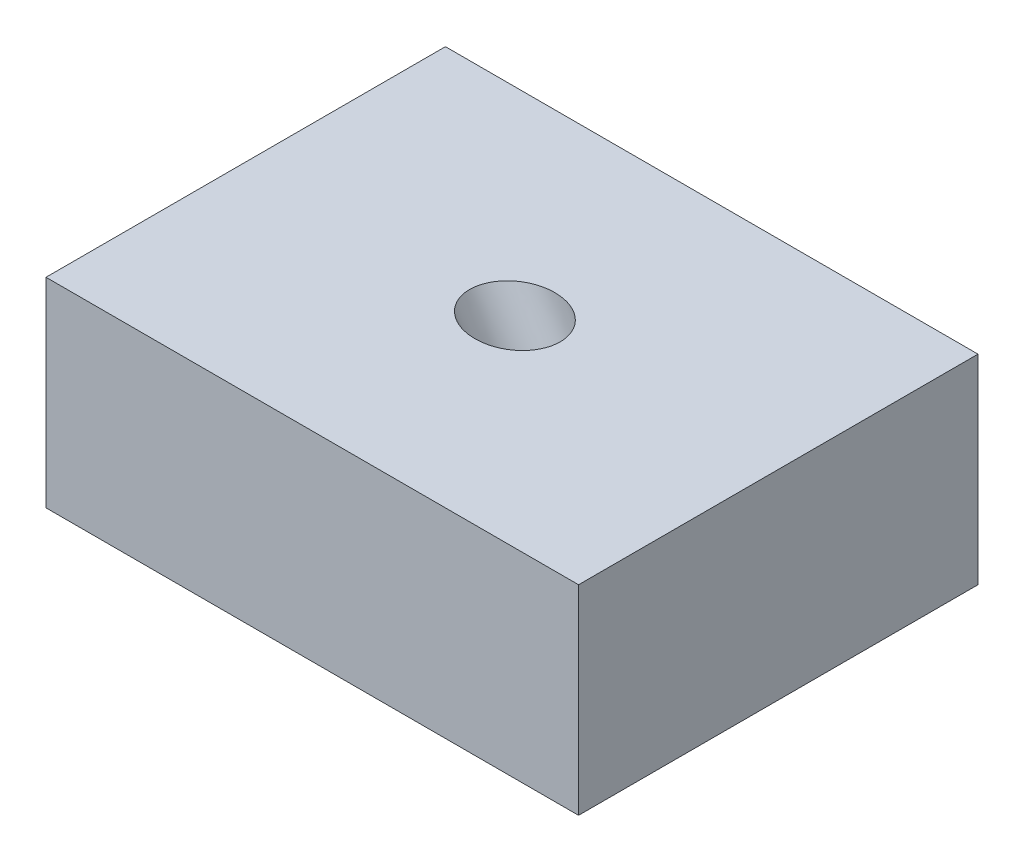
ISO-10303-21;
HEADER;
FILE_DESCRIPTION(('STEP AP214'),'2;1');
FILE_NAME('part.step','',(''),(''),'','','');
FILE_SCHEMA(('AUTOMOTIVE_DESIGN { 1 0 10303 214 1 1 1 1 }'));
ENDSEC;
DATA;
#1=APPLICATION_CONTEXT('core data for automotive mechanical design processes');
#2=APPLICATION_PROTOCOL_DEFINITION('international standard','automotive_design',2000,#1);
#3=PRODUCT_CONTEXT('',#1,'mechanical');
#4=PRODUCT('Part','Part','',(#3));
#5=PRODUCT_RELATED_PRODUCT_CATEGORY('part','',(#4));
#6=PRODUCT_DEFINITION_FORMATION('','',#4);
#7=PRODUCT_DEFINITION_CONTEXT('part definition',#1,'design');
#8=PRODUCT_DEFINITION('design','',#6,#7);
#9=PRODUCT_DEFINITION_SHAPE('','',#8);
#10=(LENGTH_UNIT() NAMED_UNIT(*) SI_UNIT(.MILLI.,.METRE.));
#11=(NAMED_UNIT(*) PLANE_ANGLE_UNIT() SI_UNIT($,.RADIAN.));
#12=(NAMED_UNIT(*) SI_UNIT($,.STERADIAN.) SOLID_ANGLE_UNIT());
#13=UNCERTAINTY_MEASURE_WITH_UNIT(LENGTH_MEASURE(1.E-05),#10,'distance_accuracy_value','');
#14=(GEOMETRIC_REPRESENTATION_CONTEXT(3) GLOBAL_UNCERTAINTY_ASSIGNED_CONTEXT((#13)) GLOBAL_UNIT_ASSIGNED_CONTEXT((#10,
#11,#12)) REPRESENTATION_CONTEXT('',''));
#15=CARTESIAN_POINT('',(0.,0.,0.));
#16=DIRECTION('',(0.,0.,1.));
#17=DIRECTION('',(1.,0.,0.));
#18=AXIS2_PLACEMENT_3D('',#15,#16,#17);
#19=CARTESIAN_POINT('',(0.,30.,0.));
#20=DIRECTION('',(0.,1.,0.));
#21=DIRECTION('',(0.,0.,1.));
#22=AXIS2_PLACEMENT_3D('',#19,#20,#21);
#23=PLANE('',#22);
#24=DIRECTION('',(0.,0.,-1.));
#25=VECTOR('',#24,1.);
#26=CARTESIAN_POINT('',(40.,30.,-30.));
#27=LINE('',#26,#25);
#28=CARTESIAN_POINT('',(40.,30.,30.));
#29=VERTEX_POINT('',#28);
#30=CARTESIAN_POINT('',(40.,30.,-30.));
#31=VERTEX_POINT('',#30);
#32=EDGE_CURVE('E240',#29,#31,#27,.T.);
#33=ORIENTED_EDGE('',*,*,#32,.T.);
#34=DIRECTION('',(-1.,0.,0.));
#35=VECTOR('',#34,1.);
#36=CARTESIAN_POINT('',(-40.,30.,-30.));
#37=LINE('',#36,#35);
#38=CARTESIAN_POINT('',(-40.,30.,-30.));
#39=VERTEX_POINT('',#38);
#40=EDGE_CURVE('E235',#31,#39,#37,.T.);
#41=ORIENTED_EDGE('',*,*,#40,.T.);
#42=DIRECTION('',(0.,0.,1.));
#43=VECTOR('',#42,1.);
#44=CARTESIAN_POINT('',(-40.,30.,-30.));
#45=LINE('',#44,#43);
#46=CARTESIAN_POINT('',(-40.,30.,30.));
#47=VERTEX_POINT('',#46);
#48=EDGE_CURVE('E238',#39,#47,#45,.T.);
#49=ORIENTED_EDGE('',*,*,#48,.T.);
#50=DIRECTION('',(1.,0.,0.));
#51=VECTOR('',#50,1.);
#52=CARTESIAN_POINT('',(-40.,30.,30.));
#53=LINE('',#52,#51);
#54=EDGE_CURVE('E205',#47,#29,#53,.T.);
#55=ORIENTED_EDGE('',*,*,#54,.T.);
#56=EDGE_LOOP('',(#33,#41,#49,#55));
#57=FACE_BOUND('',#56,.T.);
#58=CARTESIAN_POINT('',(7.02625452931541,30.,-0.221368563252611));
#59=CARTESIAN_POINT('',(7.02625536412438,30.,-0.0680039688627962));
#60=CARTESIAN_POINT('',(7.01957304740906,30.,0.0853508334510149));
#61=CARTESIAN_POINT('',(6.99292476476251,30.,0.390970297736343));
#62=CARTESIAN_POINT('',(6.97295320971541,30.,0.543234473772325));
#63=CARTESIAN_POINT('',(6.91996927202058,30.,0.845472321438903));
#64=CARTESIAN_POINT('',(6.88695680456354,30.,0.995445978166916));
#65=CARTESIAN_POINT('',(6.80830807049809,30.,1.29197342505064));
#66=CARTESIAN_POINT('',(6.76267713445538,30.,1.43852863101665));
#67=CARTESIAN_POINT('',(6.66007752915421,30.,1.72517312428354));
#68=CARTESIAN_POINT('',(6.60328569663295,30.,1.86532584440722));
#69=CARTESIAN_POINT('',(6.47862417067005,30.,2.14044098757453));
#70=CARTESIAN_POINT('',(6.41076544593485,30.,2.27540838792105));
#71=CARTESIAN_POINT('',(6.26460700739432,30.,2.53956105947798));
#72=CARTESIAN_POINT('',(6.18630707747373,30.,2.66874621093169));
#73=CARTESIAN_POINT('',(6.01997721267765,30.,2.92072266085493));
#74=CARTESIAN_POINT('',(5.93194520643918,30.,3.04351258996043));
#75=CARTESIAN_POINT('',(5.74696962591476,30.,3.2820692952767));
#76=CARTESIAN_POINT('',(5.65003100306413,30.,3.39783991500167));
#77=CARTESIAN_POINT('',(5.44795718297497,30.,3.62200125239204));
#78=CARTESIAN_POINT('',(5.34282088128674,30.,3.73039097195205));
#79=CARTESIAN_POINT('',(5.09999644616418,30.,3.96353656126034));
#80=CARTESIAN_POINT('',(4.96039235051476,30.,4.0863032760649));
#81=CARTESIAN_POINT('',(4.67129510503231,30.,4.3195921775653));
#82=CARTESIAN_POINT('',(4.52180013595067,30.,4.43011210162849));
#83=CARTESIAN_POINT('',(4.2143755116574,30.,4.63843471724071));
#84=CARTESIAN_POINT('',(4.05645284177239,30.,4.73624771691119));
#85=CARTESIAN_POINT('',(3.73330887647831,30.,4.91901237630198));
#86=CARTESIAN_POINT('',(3.56808480441496,30.,5.0039590877674));
#87=CARTESIAN_POINT('',(3.06351798708295,30.,5.2390451621415));
#88=CARTESIAN_POINT('',(2.71487439410136,30.,5.36970272094007));
#89=CARTESIAN_POINT('',(2.00241315912417,30.,5.57781472194463));
#90=CARTESIAN_POINT('',(1.63859868239182,30.,5.65528020385055));
#91=CARTESIAN_POINT('',(0.903637454972762,30.,5.7568782637916));
#92=CARTESIAN_POINT('',(0.532491489045391,30.,5.78101651907241));
#93=CARTESIAN_POINT('',(-0.209428474756599,30.,5.77587510389124));
#94=CARTESIAN_POINT('',(-0.580202476722962,30.,5.74659602763216));
#95=CARTESIAN_POINT('',(-1.31365671932585,30.,5.63473415281999));
#96=CARTESIAN_POINT('',(-1.67633628106624,29.9999999999999,5.55214690046069));
#97=CARTESIAN_POINT('',(-2.38570994387826,30.0000000000001,5.33383968649401));
#98=CARTESIAN_POINT('',(-2.73240110797264,30.0000000000003,5.19811000603965));
#99=CARTESIAN_POINT('',(-3.2333638304265,30.,4.95551463328195));
#100=CARTESIAN_POINT('',(-3.39727191602754,29.9999999999999,4.86808038797026));
#101=CARTESIAN_POINT('',(-3.7175471964158,30.0000000000001,4.68038768803319));
#102=CARTESIAN_POINT('',(-3.87391734108696,30.0000000000005,4.58013430705572));
#103=CARTESIAN_POINT('',(-4.17419451837879,30.0000000000005,4.36965248816043));
#104=CARTESIAN_POINT('',(-4.31831120612786,30.0000000000001,4.25972302469117));
#105=CARTESIAN_POINT('',(-4.59688229151964,29.9999999999999,4.02832918599172));
#106=CARTESIAN_POINT('',(-4.73134106062058,30.,3.90687008794965));
#107=CARTESIAN_POINT('',(-4.98147534936429,30.,3.66065527542485));
#108=CARTESIAN_POINT('',(-5.09779672982406,29.9999999999997,3.53655571087465));
#109=CARTESIAN_POINT('',(-5.31971320506062,30.0000000000003,3.27918880732789));
#110=CARTESIAN_POINT('',(-5.42531325651506,30.0000000000011,3.14592575302729));
#111=CARTESIAN_POINT('',(-5.61930891143354,30.0000000000009,2.87837615428511));
#112=CARTESIAN_POINT('',(-5.7083289317276,30.0000000000001,2.74454239942556));
#113=CARTESIAN_POINT('',(-5.87494133814234,29.9999999999999,2.46998133900652));
#114=CARTESIAN_POINT('',(-5.95253722859244,30.0000000000006,2.32925616510154));
#115=CARTESIAN_POINT('',(-6.09226933230408,30.0000000000006,2.04817586717094));
#116=CARTESIAN_POINT('',(-6.15494350770511,30.0000000000001,1.90808820236414));
#117=CARTESIAN_POINT('',(-6.26850904494479,29.9999999999999,1.62304733400237));
#118=CARTESIAN_POINT('',(-6.31938888973689,30.0000000000002,1.47808953159103));
#119=CARTESIAN_POINT('',(-6.40795451639184,30.0000000000003,1.18685993611834));
#120=CARTESIAN_POINT('',(-6.44584802259523,30.0000000000001,1.04065135977697));
#121=CARTESIAN_POINT('',(-6.50918595397725,29.9999999999999,0.745493054291883));
#122=CARTESIAN_POINT('',(-6.53462517530892,30.,0.596542206254291));
#123=CARTESIAN_POINT('',(-6.57272360974122,30.,0.297034081430359));
#124=CARTESIAN_POINT('',(-6.58538462371768,30.,0.146477034034386));
#125=CARTESIAN_POINT('',(-6.59777547240046,30.,-0.155101389006927));
#126=CARTESIAN_POINT('',(-6.59751118297555,30.,-0.30612252245569));
#127=CARTESIAN_POINT('',(-6.58420650018885,30.,-0.604521523762282));
#128=CARTESIAN_POINT('',(-6.57142587321872,30.,-0.751911056650899));
#129=CARTESIAN_POINT('',(-6.53364173518032,30.,-1.04495227126537));
#130=CARTESIAN_POINT('',(-6.50865136337168,30.,-1.19060564910125));
#131=CARTESIAN_POINT('',(-6.44674224057049,30.,-1.47933644037913));
#132=CARTESIAN_POINT('',(-6.40982461262918,30.,-1.62241409500855));
#133=CARTESIAN_POINT('',(-6.32442963622259,30.,-1.90521349773038));
#134=CARTESIAN_POINT('',(-6.2759418070647,30.,-2.04493207600816));
#135=CARTESIAN_POINT('',(-6.16733073376555,30.,-2.32157550902624));
#136=CARTESIAN_POINT('',(-6.10708317201679,30.,-2.45845150099632));
#137=CARTESIAN_POINT('',(-5.97589769619188,30.,-2.72704304939911));
#138=CARTESIAN_POINT('',(-5.90495534065291,30.,-2.8587564330724));
#139=CARTESIAN_POINT('',(-5.75305976186311,30.,-3.11630857793755));
#140=CARTESIAN_POINT('',(-5.67210440056629,30.,-3.24214607654084));
#141=CARTESIAN_POINT('',(-5.50090787572972,30.,-3.48734128349735));
#142=CARTESIAN_POINT('',(-5.41066593332055,30.,-3.60669844705765));
#143=CARTESIAN_POINT('',(-5.21488741414568,30.,-3.84671048505417));
#144=CARTESIAN_POINT('',(-5.10871892039051,30.,-3.96684999572656));
#145=CARTESIAN_POINT('',(-4.88759483981967,30.,-4.19851713428326));
#146=CARTESIAN_POINT('',(-4.7726475206201,30.,-4.31005267085251));
#147=CARTESIAN_POINT('',(-4.53477440632526,30.,-4.52425074359901));
#148=CARTESIAN_POINT('',(-4.41184893913304,30.,-4.62691364403904));
#149=CARTESIAN_POINT('',(-4.15888945153438,30.,-4.82307708014528));
#150=CARTESIAN_POINT('',(-4.0288539938769,30.,-4.91657575255916));
#151=CARTESIAN_POINT('',(-3.6295182969855,30.,-5.18284152078281));
#152=CARTESIAN_POINT('',(-3.35074102348365,30.,-5.34159935823776));
#153=CARTESIAN_POINT('',(-2.69336371334247,30.,-5.65950717838606));
#154=CARTESIAN_POINT('',(-2.30873961946365,30.,-5.80621043094774));
#155=CARTESIAN_POINT('',(-1.52097875124978,30.,-6.03467937227404));
#156=CARTESIAN_POINT('',(-1.11784722093076,30.,-6.11646333701816));
#157=CARTESIAN_POINT('',(-0.303856676521069,30.,-6.21486589610431));
#158=CARTESIAN_POINT('',(0.107001319444107,30.,-6.23149301661626));
#159=CARTESIAN_POINT('',(0.92639936036795,30.,-6.19947443991615));
#160=CARTESIAN_POINT('',(1.33493937955282,30.,-6.15082801834421));
#161=CARTESIAN_POINT('',(1.93763039659139,30.,-6.02917592595877));
#162=CARTESIAN_POINT('',(2.13695757160396,30.,-5.98046757580777));
#163=CARTESIAN_POINT('',(2.53091937632757,30.,-5.86686336874154));
#164=CARTESIAN_POINT('',(2.72555587891082,29.9999999999999,-5.80197409397113));
#165=CARTESIAN_POINT('',(3.10198541456625,29.9999999999999,-5.65867002484393));
#166=CARTESIAN_POINT('',(3.28398951603413,30.0000000000001,-5.5808086486003));
#167=CARTESIAN_POINT('',(3.64085550022342,29.9999999999999,-5.41029971180403));
#168=CARTESIAN_POINT('',(3.81572060848835,29.9999999999995,-5.31765892386378));
#169=CARTESIAN_POINT('',(4.14728048185672,29.9999999999995,-5.12345896952919));
#170=CARTESIAN_POINT('',(4.30444365419119,29.9999999999999,-5.02269947304134));
#171=CARTESIAN_POINT('',(4.60982752597164,30.0000000000001,-4.8085468329476));
#172=CARTESIAN_POINT('',(4.75805239322429,30.,-4.69515964877935));
#173=CARTESIAN_POINT('',(5.03563097127673,30.,-4.463346504851));
#174=CARTESIAN_POINT('',(5.16558371784352,30.,-4.34563788469248));
#175=CARTESIAN_POINT('',(5.41524377887571,30.,-4.09990163761123));
#176=CARTESIAN_POINT('',(5.5349558448162,29.9999999999999,-3.97187885039069));
#177=CARTESIAN_POINT('',(5.75639869686912,30.0000000000001,-3.7137653362959));
#178=CARTESIAN_POINT('',(5.85876928320393,30.0000000000002,-3.58422356100901));
#179=CARTESIAN_POINT('',(6.05238129517422,29.9999999999998,-3.31714496725141));
#180=CARTESIAN_POINT('',(6.14362772688858,29.9999999999991,-3.17961178651659));
#181=CARTESIAN_POINT('',(6.3098181478149,29.9999999999992,-2.9043065894059));
#182=CARTESIAN_POINT('',(6.38534815835075,29.9999999999999,-2.76688843409669));
#183=CARTESIAN_POINT('',(6.52471813371063,30.0000000000001,-2.48630572906934));
#184=CARTESIAN_POINT('',(6.58856269075731,29.9999999999996,-2.34314346379111));
#185=CARTESIAN_POINT('',(6.70722646705137,29.9999999999995,-2.04346918792488));
#186=CARTESIAN_POINT('',(6.76130871213741,30.,-1.88666423929644));
#187=CARTESIAN_POINT('',(6.85490230323734,30.,-1.56878200848353));
#188=CARTESIAN_POINT('',(6.89441548221777,29.9999999999997,-1.4077052664781));
#189=CARTESIAN_POINT('',(6.95947642526253,29.9999999999996,-1.07673449287028));
#190=CARTESIAN_POINT('',(6.98447212602064,29.9999999999999,-0.906731481921663));
#191=CARTESIAN_POINT('',(7.01786827963365,30.0000000000001,-0.564938731201045));
#192=CARTESIAN_POINT('',(7.02625359427168,30.,-0.39314750487902));
#193=CARTESIAN_POINT('',(7.02625452931541,30.,-0.221368563252611));
#194=B_SPLINE_CURVE_WITH_KNOTS('',3,(#58,#59,#60,#61,#62,#63,#64,#65,#66,#67,#68,#69,#70,#71,
#72,#73,#74,#75,#76,#77,#78,#79,#80,#81,#82,#83,#84,#85,#86,#87,#88,#89,#90,#91,#92,#93,#94,#95,
#96,#97,#98,#99,#100,#101,#102,#103,#104,#105,#106,#107,#108,#109,#110,#111,#112,#113,#114,#115,
#116,#117,#118,#119,#120,#121,#122,#123,#124,#125,#126,#127,#128,#129,#130,#131,#132,#133,#134,
#135,#136,#137,#138,#139,#140,#141,#142,#143,#144,#145,#146,#147,#148,#149,#150,#151,#152,#153,
#154,#155,#156,#157,#158,#159,#160,#161,#162,#163,#164,#165,#166,#167,#168,#169,#170,#171,#172,
#173,#174,#175,#176,#177,#178,#179,#180,#181,#182,#183,#184,#185,#186,#187,#188,#189,#190,#191,
#192,#193),.UNSPECIFIED.,.T.,.F.,(4,2,2,2,2,2,2,2,2,2,2,2,2,2,2,2,2,2,2,2,2,2,2,2,2,2,2,2,2,2,2,
2,2,2,2,2,2,2,2,2,2,2,2,2,2,2,2,2,2,2,2,2,2,2,2,2,2,2,2,2,2,2,2,2,2,2,2,4),(0.,
0.459932156598363,0.92005787133647,1.38018657847176,1.84012120427155,2.29328348640044,
2.74599932622556,3.19872453795675,3.65154629334746,4.10411781839187,4.55675042280358,
5.11375227630203,5.67085686664891,6.22750666189972,6.78436999884664,7.89664557984951,
9.00869024482438,10.1206165152102,11.2325304168428,12.344537228991,13.4567475033507,
14.0135711330731,14.5701750574395,15.1133517701889,15.6562810553196,16.1659986375239,
16.6754794839711,17.1571548292588,17.6386821123483,18.0985742584281,18.5589136104426,
19.011502246675,19.4642798296175,19.9169935921747,20.3695015520641,20.8128128928237,
21.2556482207017,21.6984418640644,22.1416381382701,22.5898017093356,23.0381519145136,
23.4865980203278,23.9350817682045,24.4155742161055,24.8956196031056,25.3756452726489,
25.8557683384647,26.8150278056708,28.044068510475,29.2727630947731,30.5012968915316,
31.7298443218074,32.3448572446918,32.9596203969757,33.5528486180175,34.1458057710992,
34.7052593473161,35.2644500082307,35.78988516714,36.3150751969685,36.8098556978507,
37.3044127097902,37.7743096014688,38.2440214317634,38.7409402748898,39.2377965782034,
39.752483515052,40.2676393070049),.UNSPECIFIED.);
#195=CARTESIAN_POINT('',(7.02625452931541,30.,-0.221368563252611));
#196=VERTEX_POINT('',#195);
#197=EDGE_CURVE('E256',#196,#196,#194,.T.);
#198=ORIENTED_EDGE('',*,*,#197,.T.);
#199=EDGE_LOOP('',(#198));
#200=FACE_BOUND('',#199,.T.);
#201=ADVANCED_FACE('F182',(#57,#200),#23,.T.);
#202=CARTESIAN_POINT('',(0.,0.,0.));
#203=DIRECTION('',(0.,1.,0.));
#204=DIRECTION('',(0.,0.,1.));
#205=AXIS2_PLACEMENT_3D('',#202,#203,#204);
#206=PLANE('',#205);
#207=DIRECTION('',(0.,0.,-1.));
#208=VECTOR('',#207,1.);
#209=CARTESIAN_POINT('',(40.,0.,-30.));
#210=LINE('',#209,#208);
#211=CARTESIAN_POINT('',(40.,0.,30.));
#212=VERTEX_POINT('',#211);
#213=CARTESIAN_POINT('',(40.,0.,-30.));
#214=VERTEX_POINT('',#213);
#215=EDGE_CURVE('E253',#212,#214,#210,.T.);
#216=ORIENTED_EDGE('',*,*,#215,.F.);
#217=DIRECTION('',(1.,0.,0.));
#218=VECTOR('',#217,1.);
#219=CARTESIAN_POINT('',(-40.,0.,30.));
#220=LINE('',#219,#218);
#221=CARTESIAN_POINT('',(-40.,0.,30.));
#222=VERTEX_POINT('',#221);
#223=EDGE_CURVE('E228',#222,#212,#220,.T.);
#224=ORIENTED_EDGE('',*,*,#223,.F.);
#225=DIRECTION('',(0.,0.,1.));
#226=VECTOR('',#225,1.);
#227=CARTESIAN_POINT('',(-40.,0.,-30.));
#228=LINE('',#227,#226);
#229=CARTESIAN_POINT('',(-40.,0.,-30.));
#230=VERTEX_POINT('',#229);
#231=EDGE_CURVE('E222',#230,#222,#228,.T.);
#232=ORIENTED_EDGE('',*,*,#231,.F.);
#233=DIRECTION('',(-1.,0.,0.));
#234=VECTOR('',#233,1.);
#235=CARTESIAN_POINT('',(-40.,0.,-30.));
#236=LINE('',#235,#234);
#237=EDGE_CURVE('E244',#214,#230,#236,.T.);
#238=ORIENTED_EDGE('',*,*,#237,.F.);
#239=EDGE_LOOP('',(#216,#224,#232,#238));
#240=FACE_BOUND('',#239,.T.);
#241=CARTESIAN_POINT('',(25.343626424977,0.,-0.221368563252611));
#242=CARTESIAN_POINT('',(25.3436272597859,0.,-0.0680039688627962));
#243=CARTESIAN_POINT('',(25.3369449430706,0.,0.0853508334510149));
#244=CARTESIAN_POINT('',(25.3102966604241,0.,0.390970297736343));
#245=CARTESIAN_POINT('',(25.290325105377,0.,0.543234473772325));
#246=CARTESIAN_POINT('',(25.2373411676821,0.,0.845472321438903));
#247=CARTESIAN_POINT('',(25.2043287002251,0.,0.995445978166916));
#248=CARTESIAN_POINT('',(25.1256799661596,0.,1.29197342505064));
#249=CARTESIAN_POINT('',(25.0800490301169,0.,1.43852863101665));
#250=CARTESIAN_POINT('',(24.9774494248157,0.,1.72517312428354));
#251=CARTESIAN_POINT('',(24.9206575922945,0.,1.86532584440723));
#252=CARTESIAN_POINT('',(24.7959960663316,0.,2.14044098757453));
#253=CARTESIAN_POINT('',(24.7281373415964,0.,2.27540838792105));
#254=CARTESIAN_POINT('',(24.5819789030559,0.,2.53956105947798));
#255=CARTESIAN_POINT('',(24.5036789731353,0.,2.66874621093169));
#256=CARTESIAN_POINT('',(24.3373491083392,0.,2.92072266085494));
#257=CARTESIAN_POINT('',(24.2493171021007,0.,3.04351258996044));
#258=CARTESIAN_POINT('',(24.0643415215763,0.,3.2820692952767));
#259=CARTESIAN_POINT('',(23.9674028987257,0.,3.39783991500167));
#260=CARTESIAN_POINT('',(23.7653290786365,0.,3.62200125239205));
#261=CARTESIAN_POINT('',(23.6601927769483,0.,3.73039097195205));
#262=CARTESIAN_POINT('',(23.4173683418257,0.,3.96353656126035));
#263=CARTESIAN_POINT('',(23.2777642461763,0.,4.08630327606491));
#264=CARTESIAN_POINT('',(22.9886670006938,0.,4.31959217756531));
#265=CARTESIAN_POINT('',(22.8391720316122,0.,4.43011210162849));
#266=CARTESIAN_POINT('',(22.5317474073189,0.,4.63843471724071));
#267=CARTESIAN_POINT('',(22.3738247374339,0.,4.73624771691119));
#268=CARTESIAN_POINT('',(22.0506807721399,0.,4.91901237630198));
#269=CARTESIAN_POINT('',(21.8854567000765,0.,5.0039590877674));
#270=CARTESIAN_POINT('',(21.3808898827445,0.,5.2390451621415));
#271=CARTESIAN_POINT('',(21.0322462897629,0.,5.36970272094007));
#272=CARTESIAN_POINT('',(20.3197850547857,0.,5.57781472194462));
#273=CARTESIAN_POINT('',(19.9559705780534,0.,5.65528020385055));
#274=CARTESIAN_POINT('',(19.2210093506343,0.,5.7568782637916));
#275=CARTESIAN_POINT('',(18.8498633847069,0.,5.78101651907241));
#276=CARTESIAN_POINT('',(18.107943420905,0.,5.77587510389124));
#277=CARTESIAN_POINT('',(17.7371694189386,0.,5.74659602763217));
#278=CARTESIAN_POINT('',(17.0037151763357,0.,5.63473415281999));
#279=CARTESIAN_POINT('',(16.6410356145953,0.,5.5521469004607));
#280=CARTESIAN_POINT('',(15.9316619517833,0.,5.33383968649402));
#281=CARTESIAN_POINT('',(15.5849707876889,2.6343760346674E-13,5.19811000603966));
#282=CARTESIAN_POINT('',(15.0840080652351,0.,4.95551463328196));
#283=CARTESIAN_POINT('',(14.920099979634,-1.24902885144757E-13,4.86808038797028));
#284=CARTESIAN_POINT('',(14.5998246992458,1.24853602335308E-13,4.6803876880332));
#285=CARTESIAN_POINT('',(14.4434545545746,5.34004683181989E-13,4.58013430705574));
#286=CARTESIAN_POINT('',(14.1431773772828,5.20867580971182E-13,4.36965248816045));
#287=CARTESIAN_POINT('',(13.9990606895337,1.18398486522596E-13,4.25972302469119));
#288=CARTESIAN_POINT('',(13.7204896041419,-1.18344553695792E-13,4.02832918599174));
#289=CARTESIAN_POINT('',(13.586030835041,0.,3.90687008794967));
#290=CARTESIAN_POINT('',(13.3358965462973,0.,3.66065527542487));
#291=CARTESIAN_POINT('',(13.2195751658375,-2.75857135667784E-13,3.53655571087468));
#292=CARTESIAN_POINT('',(12.9976586906009,2.757290152141E-13,3.27918880732792));
#293=CARTESIAN_POINT('',(12.8920586391465,1.05846082524663E-12,3.14592575302731));
#294=CARTESIAN_POINT('',(12.698062984228,9.16176627688767E-13,2.87837615428513));
#295=CARTESIAN_POINT('',(12.609042963934,0.,2.74454239942558));
#296=CARTESIAN_POINT('',(12.4424305575192,0.,2.46998133900654));
#297=CARTESIAN_POINT('',(12.3648346670691,5.87638728284361E-13,2.32925616510157));
#298=CARTESIAN_POINT('',(12.2251025633575,6.59705968307708E-13,2.04817586717097));
#299=CARTESIAN_POINT('',(12.1624283879564,1.17712987058822E-13,1.90808820236417));
#300=CARTESIAN_POINT('',(12.0488628507168,-1.17827452910996E-13,1.6230473340024));
#301=CARTESIAN_POINT('',(11.9979830059247,1.89450641864751E-13,1.47808953159105));
#302=CARTESIAN_POINT('',(11.9094173792697,2.81611700537357E-13,1.18685993611836));
#303=CARTESIAN_POINT('',(11.8715238730663,0.,1.04065135977699));
#304=CARTESIAN_POINT('',(11.8081859416843,0.,0.745493054291911));
#305=CARTESIAN_POINT('',(11.7827467203526,0.,0.596542206254317));
#306=CARTESIAN_POINT('',(11.7446482859203,0.,0.297034081430385));
#307=CARTESIAN_POINT('',(11.7319872719439,0.,0.146477034034412));
#308=CARTESIAN_POINT('',(11.7195964232611,0.,-0.1551013890069));
#309=CARTESIAN_POINT('',(11.719860712686,0.,-0.306122522455664));
#310=CARTESIAN_POINT('',(11.7331653954727,0.,-0.604521523762255));
#311=CARTESIAN_POINT('',(11.7459460224428,0.,-0.751911056650872));
#312=CARTESIAN_POINT('',(11.7837301604812,0.,-1.04495227126534));
#313=CARTESIAN_POINT('',(11.8087205322898,0.,-1.19060564910123));
#314=CARTESIAN_POINT('',(11.870629655091,0.,-1.47933644037911));
#315=CARTESIAN_POINT('',(11.9075472830324,0.,-1.62241409500853));
#316=CARTESIAN_POINT('',(11.9929422594389,0.,-1.90521349773036));
#317=CARTESIAN_POINT('',(12.0414300885968,0.,-2.04493207600814));
#318=CARTESIAN_POINT('',(12.150041161896,0.,-2.32157550902622));
#319=CARTESIAN_POINT('',(12.2102887236447,0.,-2.4584515009963));
#320=CARTESIAN_POINT('',(12.3414741994697,0.,-2.72704304939909));
#321=CARTESIAN_POINT('',(12.4124165550086,0.,-2.85875643307238));
#322=CARTESIAN_POINT('',(12.5643121337984,0.,-3.11630857793754));
#323=CARTESIAN_POINT('',(12.6452674950952,0.,-3.24214607654082));
#324=CARTESIAN_POINT('',(12.8164640199318,0.,-3.48734128349734));
#325=CARTESIAN_POINT('',(12.906705962341,0.,-3.60669844705763));
#326=CARTESIAN_POINT('',(13.1024844815158,0.,-3.84671048505416));
#327=CARTESIAN_POINT('',(13.208652975271,0.,-3.96684999572655));
#328=CARTESIAN_POINT('',(13.4297770558419,0.,-4.19851713428324));
#329=CARTESIAN_POINT('',(13.5447243750414,0.,-4.3100526708525));
#330=CARTESIAN_POINT('',(13.7825974893363,0.,-4.524250743599));
#331=CARTESIAN_POINT('',(13.9055229565285,0.,-4.62691364403903));
#332=CARTESIAN_POINT('',(14.1584824441271,0.,-4.82307708014527));
#333=CARTESIAN_POINT('',(14.2885179017846,0.,-4.91657575255915));
#334=CARTESIAN_POINT('',(14.687853598676,0.,-5.1828415207828));
#335=CARTESIAN_POINT('',(14.9666308721779,0.,-5.34159935823775));
#336=CARTESIAN_POINT('',(15.6240081823191,0.,-5.65950717838605));
#337=CARTESIAN_POINT('',(16.0086322761979,0.,-5.80621043094774));
#338=CARTESIAN_POINT('',(16.7963931444117,0.,-6.03467937227404));
#339=CARTESIAN_POINT('',(17.1995246747308,0.,-6.11646333701815));
#340=CARTESIAN_POINT('',(18.0135152191404,0.,-6.21486589610431));
#341=CARTESIAN_POINT('',(18.4243732151056,0.,-6.23149301661625));
#342=CARTESIAN_POINT('',(19.2437712560295,0.,-6.19947443991615));
#343=CARTESIAN_POINT('',(19.6523112752143,0.,-6.15082801834421));
#344=CARTESIAN_POINT('',(20.2550022922529,0.,-6.02917592595877));
#345=CARTESIAN_POINT('',(20.4543294672655,0.,-5.98046757580778));
#346=CARTESIAN_POINT('',(20.8482912719891,0.,-5.86686336874155));
#347=CARTESIAN_POINT('',(21.0429277745723,-1.51080523024271E-13,-5.80197409397115));
#348=CARTESIAN_POINT('',(21.4193573102277,0.,-5.65867002484395));
#349=CARTESIAN_POINT('',(21.6013614116956,1.08289663139101E-13,-5.58080864860032));
#350=CARTESIAN_POINT('',(21.9582273958849,-1.08240181578639E-13,-5.41029971180405));
#351=CARTESIAN_POINT('',(22.1330925041499,-5.05162995816677E-13,-5.31765892386381));
#352=CARTESIAN_POINT('',(22.4646523775182,-4.94352029258844E-13,-5.12345896952922));
#353=CARTESIAN_POINT('',(22.6218155498527,-1.30816188371279E-13,-5.02269947304137));
#354=CARTESIAN_POINT('',(22.9271994216332,1.30754711281557E-13,-4.80854683294763));
#355=CARTESIAN_POINT('',(23.0754242888858,0.,-4.69515964877938));
#356=CARTESIAN_POINT('',(23.3530028669382,0.,-4.46334650485102));
#357=CARTESIAN_POINT('',(23.482955613505,0.,-4.34563788469251));
#358=CARTESIAN_POINT('',(23.7326156745372,0.,-4.09990163761127));
#359=CARTESIAN_POINT('',(23.8523277404777,0.,-3.97187885039072));
#360=CARTESIAN_POINT('',(24.0737705925306,0.,-3.71376533629593));
#361=CARTESIAN_POINT('',(24.1761411788654,2.33015207079525E-13,-3.58422356100904));
#362=CARTESIAN_POINT('',(24.3697531908357,-2.32909955716184E-13,-3.31714496725144));
#363=CARTESIAN_POINT('',(24.4609996225501,-8.69278083050348E-13,-3.17961178651662));
#364=CARTESIAN_POINT('',(24.6271900434764,-7.7081839390022E-13,-2.90430658940593));
#365=CARTESIAN_POINT('',(24.7027200540123,-1.02780370138283E-13,-2.76688843409672));
#366=CARTESIAN_POINT('',(24.8420900293722,1.02739891731463E-13,-2.48630572906937));
#367=CARTESIAN_POINT('',(24.9059345864188,-3.59332722441836E-13,-2.34314346379115));
#368=CARTESIAN_POINT('',(25.0245983627129,-4.48076781434955E-13,-2.04346918792491));
#369=CARTESIAN_POINT('',(25.0786806077989,0.,-1.88666423929647));
#370=CARTESIAN_POINT('',(25.1722741988989,0.,-1.56878200848355));
#371=CARTESIAN_POINT('',(25.2117873778793,-3.48745951461201E-13,-1.40770526647812));
#372=CARTESIAN_POINT('',(25.2768483209241,-4.29839616708026E-13,-1.07673449287029));
#373=CARTESIAN_POINT('',(25.3018440216822,-1.12999120755371E-13,-0.906731481921673));
#374=CARTESIAN_POINT('',(25.3352401752952,1.13102057532581E-13,-0.56493873120105));
#375=CARTESIAN_POINT('',(25.3436254899332,0.,-0.393147504879023));
#376=CARTESIAN_POINT('',(25.343626424977,0.,-0.221368563252611));
#377=B_SPLINE_CURVE_WITH_KNOTS('',3,(#241,#242,#243,#244,#245,#246,#247,#248,#249,#250,#251,
#252,#253,#254,#255,#256,#257,#258,#259,#260,#261,#262,#263,#264,#265,#266,#267,#268,#269,#270,
#271,#272,#273,#274,#275,#276,#277,#278,#279,#280,#281,#282,#283,#284,#285,#286,#287,#288,#289,
#290,#291,#292,#293,#294,#295,#296,#297,#298,#299,#300,#301,#302,#303,#304,#305,#306,#307,#308,
#309,#310,#311,#312,#313,#314,#315,#316,#317,#318,#319,#320,#321,#322,#323,#324,#325,#326,#327,
#328,#329,#330,#331,#332,#333,#334,#335,#336,#337,#338,#339,#340,#341,#342,#343,#344,#345,#346,
#347,#348,#349,#350,#351,#352,#353,#354,#355,#356,#357,#358,#359,#360,#361,#362,#363,#364,#365,
#366,#367,#368,#369,#370,#371,#372,#373,#374,#375,#376),.UNSPECIFIED.,.T.,.F.,(4,2,2,2,2,2,2,2,
2,2,2,2,2,2,2,2,2,2,2,2,2,2,2,2,2,2,2,2,2,2,2,2,2,2,2,2,2,2,2,2,2,2,2,2,2,2,2,2,2,2,2,2,2,2,2,2,
2,2,2,2,2,2,2,2,2,2,2,4),(0.,0.459932156598363,0.920057871336471,1.38018657847176,
1.84012120427155,2.29328348640044,2.74599932622557,3.19872453795676,3.65154629334747,
4.10411781839188,4.55675042280359,5.11375227630204,5.67085686664892,6.22750666189972,
6.78436999884664,7.8966455798495,9.00869024482437,10.1206165152102,11.2325304168428,
12.344537228991,13.4567475033506,14.013571133073,14.5701750574395,15.1133517701888,
15.6562810553195,16.1659986375239,16.6754794839711,17.1571548292587,17.6386821123483,
18.0985742584281,18.5589136104426,19.0115022466749,19.4642798296175,19.9169935921747,
20.3695015520641,20.8128128928237,21.2556482207016,21.6984418640643,22.1416381382701,
22.5898017093356,23.0381519145135,23.4865980203278,23.9350817682045,24.4155742161054,
24.8956196031055,25.3756452726488,25.8557683384647,26.8150278056708,28.044068510475,
29.2727630947731,30.5012968915316,31.7298443218074,32.3448572446918,32.9596203969757,
33.5528486180175,34.1458057710992,34.705259347316,35.2644500082307,35.7898851671399,
36.3150751969685,36.8098556978507,37.3044127097901,37.7743096014687,38.2440214317633,
38.7409402748898,39.2377965782034,39.752483515052,40.2676393070049),.UNSPECIFIED.);
#378=CARTESIAN_POINT('',(25.343626424977,0.,-0.221368563252611));
#379=VERTEX_POINT('',#378);
#380=EDGE_CURVE('E186',#379,#379,#377,.T.);
#381=ORIENTED_EDGE('',*,*,#380,.F.);
#382=EDGE_LOOP('',(#381));
#383=FACE_BOUND('',#382,.T.);
#384=ADVANCED_FACE('F264',(#240,#383),#206,.F.);
#385=CARTESIAN_POINT('',(40.,30.,-30.));
#386=DIRECTION('',(-1.,0.,0.));
#387=DIRECTION('',(0.,0.,1.));
#388=AXIS2_PLACEMENT_3D('',#385,#386,#387);
#389=PLANE('',#388);
#390=ORIENTED_EDGE('',*,*,#215,.T.);
#391=DIRECTION('',(0.,-1.,0.));
#392=VECTOR('',#391,1.);
#393=CARTESIAN_POINT('',(40.,30.,-30.));
#394=LINE('',#393,#392);
#395=EDGE_CURVE('E13',#31,#214,#394,.T.);
#396=ORIENTED_EDGE('',*,*,#395,.F.);
#397=ORIENTED_EDGE('',*,*,#32,.F.);
#398=DIRECTION('',(0.,-1.,0.));
#399=VECTOR('',#398,1.);
#400=CARTESIAN_POINT('',(40.,30.,30.));
#401=LINE('',#400,#399);
#402=EDGE_CURVE('E249',#29,#212,#401,.T.);
#403=ORIENTED_EDGE('',*,*,#402,.T.);
#404=EDGE_LOOP('',(#390,#396,#397,#403));
#405=FACE_BOUND('',#404,.T.);
#406=ADVANCED_FACE('F184',(#405),#389,.F.);
#407=CARTESIAN_POINT('',(-40.,30.,-30.));
#408=DIRECTION('',(0.,0.,1.));
#409=DIRECTION('',(1.,0.,0.));
#410=AXIS2_PLACEMENT_3D('',#407,#408,#409);
#411=PLANE('',#410);
#412=ORIENTED_EDGE('',*,*,#237,.T.);
#413=DIRECTION('',(0.,-1.,0.));
#414=VECTOR('',#413,1.);
#415=CARTESIAN_POINT('',(-40.,30.,-30.));
#416=LINE('',#415,#414);
#417=EDGE_CURVE('E197',#39,#230,#416,.T.);
#418=ORIENTED_EDGE('',*,*,#417,.F.);
#419=ORIENTED_EDGE('',*,*,#40,.F.);
#420=ORIENTED_EDGE('',*,*,#395,.T.);
#421=EDGE_LOOP('',(#412,#418,#419,#420));
#422=FACE_BOUND('',#421,.T.);
#423=ADVANCED_FACE('F243',(#422),#411,.F.);
#424=CARTESIAN_POINT('',(-40.,30.,-30.));
#425=DIRECTION('',(1.,0.,0.));
#426=DIRECTION('',(0.,0.,-1.));
#427=AXIS2_PLACEMENT_3D('',#424,#425,#426);
#428=PLANE('',#427);
#429=ORIENTED_EDGE('',*,*,#231,.T.);
#430=DIRECTION('',(0.,-1.,0.));
#431=VECTOR('',#430,1.);
#432=CARTESIAN_POINT('',(-40.,30.,30.));
#433=LINE('',#432,#431);
#434=EDGE_CURVE('E245',#47,#222,#433,.T.);
#435=ORIENTED_EDGE('',*,*,#434,.F.);
#436=ORIENTED_EDGE('',*,*,#48,.F.);
#437=ORIENTED_EDGE('',*,*,#417,.T.);
#438=EDGE_LOOP('',(#429,#435,#436,#437));
#439=FACE_BOUND('',#438,.T.);
#440=ADVANCED_FACE('F247',(#439),#428,.F.);
#441=CARTESIAN_POINT('',(-40.,30.,30.));
#442=DIRECTION('',(0.,0.,-1.));
#443=DIRECTION('',(-1.,0.,0.));
#444=AXIS2_PLACEMENT_3D('',#441,#442,#443);
#445=PLANE('',#444);
#446=ORIENTED_EDGE('',*,*,#223,.T.);
#447=ORIENTED_EDGE('',*,*,#402,.F.);
#448=ORIENTED_EDGE('',*,*,#54,.F.);
#449=ORIENTED_EDGE('',*,*,#434,.T.);
#450=EDGE_LOOP('',(#446,#447,#448,#449));
#451=FACE_BOUND('',#450,.T.);
#452=ADVANCED_FACE('F261',(#451),#445,.F.);
#453=CARTESIAN_POINT('',(-17.3505878743022,58.7689129788524,-0.221368563252611));
#454=DIRECTION('',(0.293589123508279,-0.955931706011282,0.));
#455=DIRECTION('',(0.955931706011282,0.293589123508279,0.));
#456=AXIS2_PLACEMENT_3D('',#453,#454,#455);
#457=CIRCLE('',#456,6.);
#458=DIRECTION('',(-0.521119348849061,0.853483816047575,0.));
#459=VECTOR('',#458,1.);
#460=SURFACE_OF_LINEAR_EXTRUSION('',#457,#459);
#461=ORIENTED_EDGE('',*,*,#197,.F.);
#462=EDGE_LOOP('',(#461));
#463=FACE_BOUND('',#462,.T.);
#464=ORIENTED_EDGE('',*,*,#380,.T.);
#465=EDGE_LOOP('',(#464));
#466=FACE_BOUND('',#465,.T.);
#467=ADVANCED_FACE('F276',(#463,#466),#460,.T.);
#468=CLOSED_SHELL('',(#201,#384,#406,#423,#440,#452,#467));
#469=MANIFOLD_SOLID_BREP('B2',#468);
#470=ADVANCED_BREP_SHAPE_REPRESENTATION('',(#18,#469),#14);
#471=SHAPE_DEFINITION_REPRESENTATION(#9,#470);
ENDSEC;
END-ISO-10303-21;
